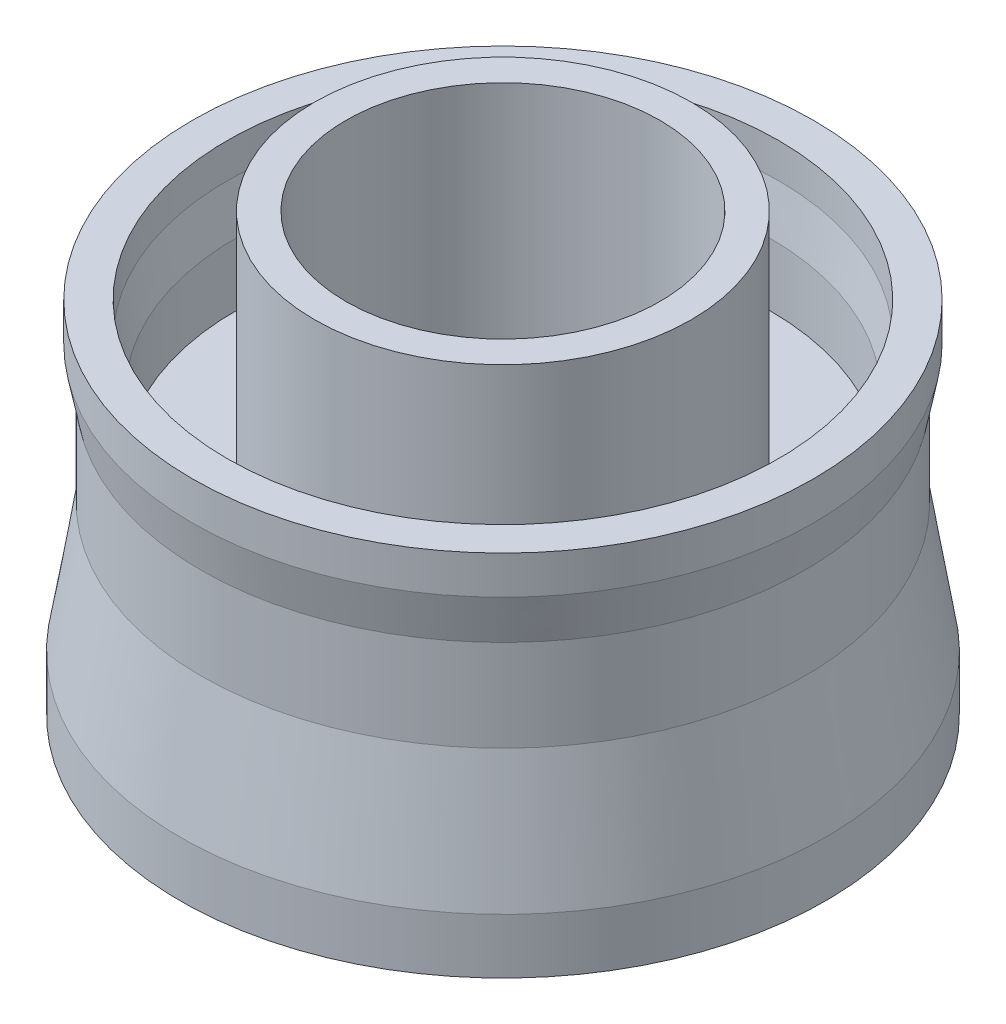
ISO-10303-21;
HEADER;
FILE_DESCRIPTION(('STEP AP214'),'2;1');
FILE_NAME('part.step','',(''),(''),'','','');
FILE_SCHEMA(('AUTOMOTIVE_DESIGN { 1 0 10303 214 1 1 1 1 }'));
ENDSEC;
DATA;
#1=APPLICATION_CONTEXT('core data for automotive mechanical design processes');
#2=APPLICATION_PROTOCOL_DEFINITION('international standard','automotive_design',2000,#1);
#3=PRODUCT_CONTEXT('',#1,'mechanical');
#4=PRODUCT('Part','Part','',(#3));
#5=PRODUCT_RELATED_PRODUCT_CATEGORY('part','',(#4));
#6=PRODUCT_DEFINITION_FORMATION('','',#4);
#7=PRODUCT_DEFINITION_CONTEXT('part definition',#1,'design');
#8=PRODUCT_DEFINITION('design','',#6,#7);
#9=PRODUCT_DEFINITION_SHAPE('','',#8);
#10=(LENGTH_UNIT() NAMED_UNIT(*) SI_UNIT(.MILLI.,.METRE.));
#11=(NAMED_UNIT(*) PLANE_ANGLE_UNIT() SI_UNIT($,.RADIAN.));
#12=(NAMED_UNIT(*) SI_UNIT($,.STERADIAN.) SOLID_ANGLE_UNIT());
#13=UNCERTAINTY_MEASURE_WITH_UNIT(LENGTH_MEASURE(1.E-05),#10,'distance_accuracy_value','');
#14=(GEOMETRIC_REPRESENTATION_CONTEXT(3) GLOBAL_UNCERTAINTY_ASSIGNED_CONTEXT((#13)) GLOBAL_UNIT_ASSIGNED_CONTEXT((#10,
#11,#12)) REPRESENTATION_CONTEXT('',''));
#15=CARTESIAN_POINT('',(0.,0.,0.));
#16=DIRECTION('',(0.,0.,1.));
#17=DIRECTION('',(1.,0.,0.));
#18=AXIS2_PLACEMENT_3D('',#15,#16,#17);
#19=CARTESIAN_POINT('',(0.,0.,0.));
#20=DIRECTION('',(0.,-1.,0.));
#21=DIRECTION('',(0.,0.,-1.));
#22=AXIS2_PLACEMENT_3D('',#19,#20,#21);
#23=CYLINDRICAL_SURFACE('',#22,5.4);
#24=CARTESIAN_POINT('',(0.,12.5,0.));
#25=DIRECTION('',(0.,-1.,0.));
#26=DIRECTION('',(0.,0.,-1.));
#27=AXIS2_PLACEMENT_3D('',#24,#25,#26);
#28=CIRCLE('',#27,5.4);
#29=CARTESIAN_POINT('',(0.,12.5,-5.4));
#30=VERTEX_POINT('',#29);
#31=EDGE_CURVE('E41',#30,#30,#28,.T.);
#32=ORIENTED_EDGE('',*,*,#31,.T.);
#33=EDGE_LOOP('',(#32));
#34=FACE_BOUND('',#33,.T.);
#35=CARTESIAN_POINT('',(0.,6.2,0.));
#36=DIRECTION('',(0.,-1.,0.));
#37=DIRECTION('',(0.,0.,-1.));
#38=AXIS2_PLACEMENT_3D('',#35,#36,#37);
#39=CIRCLE('',#38,5.4);
#40=CARTESIAN_POINT('',(0.,6.2,-5.4));
#41=VERTEX_POINT('',#40);
#42=EDGE_CURVE('E66',#41,#41,#39,.T.);
#43=ORIENTED_EDGE('',*,*,#42,.F.);
#44=EDGE_LOOP('',(#43));
#45=FACE_BOUND('',#44,.T.);
#46=ADVANCED_FACE('F35',(#34,#45),#23,.T.);
#47=CARTESIAN_POINT('',(0.,12.5,-4.5));
#48=DIRECTION('',(0.,1.,0.));
#49=DIRECTION('',(0.,0.,1.));
#50=AXIS2_PLACEMENT_3D('',#47,#48,#49);
#51=PLANE('',#50);
#52=CARTESIAN_POINT('',(0.,12.5,0.));
#53=DIRECTION('',(0.,-1.,0.));
#54=DIRECTION('',(0.,0.,-1.));
#55=AXIS2_PLACEMENT_3D('',#52,#53,#54);
#56=CIRCLE('',#55,4.5);
#57=CARTESIAN_POINT('',(0.,12.5,-4.5));
#58=VERTEX_POINT('',#57);
#59=EDGE_CURVE('E45',#58,#58,#56,.T.);
#60=ORIENTED_EDGE('',*,*,#59,.T.);
#61=EDGE_LOOP('',(#60));
#62=FACE_BOUND('',#61,.T.);
#63=ORIENTED_EDGE('',*,*,#31,.F.);
#64=EDGE_LOOP('',(#63));
#65=FACE_BOUND('',#64,.T.);
#66=ADVANCED_FACE('F142',(#62,#65),#51,.T.);
#67=CARTESIAN_POINT('',(0.,0.,0.));
#68=DIRECTION('',(0.,-1.,0.));
#69=DIRECTION('',(0.,0.,-1.));
#70=AXIS2_PLACEMENT_3D('',#67,#68,#69);
#71=CYLINDRICAL_SURFACE('',#70,4.5);
#72=CARTESIAN_POINT('',(0.,4.3,0.));
#73=DIRECTION('',(0.,-1.,0.));
#74=DIRECTION('',(0.,0.,-1.));
#75=AXIS2_PLACEMENT_3D('',#72,#73,#74);
#76=CIRCLE('',#75,4.5);
#77=CARTESIAN_POINT('',(0.,4.3,-4.5));
#78=VERTEX_POINT('',#77);
#79=EDGE_CURVE('E49',#78,#78,#76,.T.);
#80=ORIENTED_EDGE('',*,*,#79,.T.);
#81=EDGE_LOOP('',(#80));
#82=FACE_BOUND('',#81,.T.);
#83=ORIENTED_EDGE('',*,*,#59,.F.);
#84=EDGE_LOOP('',(#83));
#85=FACE_BOUND('',#84,.T.);
#86=ADVANCED_FACE('F146',(#82,#85),#71,.F.);
#87=CARTESIAN_POINT('',(0.,4.3,-4.65));
#88=DIRECTION('',(0.,-1.,0.));
#89=DIRECTION('',(0.,0.,-1.));
#90=AXIS2_PLACEMENT_3D('',#87,#88,#89);
#91=PLANE('',#90);
#92=CARTESIAN_POINT('',(0.,4.3,0.));
#93=DIRECTION('',(0.,-1.,0.));
#94=DIRECTION('',(0.,0.,-1.));
#95=AXIS2_PLACEMENT_3D('',#92,#93,#94);
#96=CIRCLE('',#95,4.65);
#97=CARTESIAN_POINT('',(0.,4.3,-4.65));
#98=VERTEX_POINT('',#97);
#99=EDGE_CURVE('E54',#98,#98,#96,.T.);
#100=ORIENTED_EDGE('',*,*,#99,.T.);
#101=EDGE_LOOP('',(#100));
#102=FACE_BOUND('',#101,.T.);
#103=ORIENTED_EDGE('',*,*,#79,.F.);
#104=EDGE_LOOP('',(#103));
#105=FACE_BOUND('',#104,.T.);
#106=ADVANCED_FACE('F179',(#102,#105),#91,.T.);
#107=CARTESIAN_POINT('',(0.,0.,0.));
#108=DIRECTION('',(0.,-1.,0.));
#109=DIRECTION('',(0.,0.,-1.));
#110=AXIS2_PLACEMENT_3D('',#107,#108,#109);
#111=CYLINDRICAL_SURFACE('',#110,4.65);
#112=CARTESIAN_POINT('',(0.,1.,0.));
#113=DIRECTION('',(0.,-1.,0.));
#114=DIRECTION('',(0.,0.,-1.));
#115=AXIS2_PLACEMENT_3D('',#112,#113,#114);
#116=CIRCLE('',#115,4.65);
#117=CARTESIAN_POINT('',(0.,1.,-4.65));
#118=VERTEX_POINT('',#117);
#119=EDGE_CURVE('E57',#118,#118,#116,.T.);
#120=ORIENTED_EDGE('',*,*,#119,.T.);
#121=EDGE_LOOP('',(#120));
#122=FACE_BOUND('',#121,.T.);
#123=ORIENTED_EDGE('',*,*,#99,.F.);
#124=EDGE_LOOP('',(#123));
#125=FACE_BOUND('',#124,.T.);
#126=ADVANCED_FACE('F175',(#122,#125),#111,.F.);
#127=CARTESIAN_POINT('',(0.,1.,0.));
#128=DIRECTION('',(0.,-1.,0.));
#129=DIRECTION('',(0.,0.,-1.));
#130=AXIS2_PLACEMENT_3D('',#127,#128,#129);
#131=CONICAL_SURFACE('',#130,4.65,0.148889947609497);
#132=CARTESIAN_POINT('',(0.,0.,0.));
#133=DIRECTION('',(0.,-1.,0.));
#134=DIRECTION('',(0.,0.,-1.));
#135=AXIS2_PLACEMENT_3D('',#132,#133,#134);
#136=CIRCLE('',#135,4.8);
#137=CARTESIAN_POINT('',(0.,0.,-4.8));
#138=VERTEX_POINT('',#137);
#139=EDGE_CURVE('E60',#138,#138,#136,.T.);
#140=ORIENTED_EDGE('',*,*,#139,.T.);
#141=EDGE_LOOP('',(#140));
#142=FACE_BOUND('',#141,.T.);
#143=ORIENTED_EDGE('',*,*,#119,.F.);
#144=EDGE_LOOP('',(#143));
#145=FACE_BOUND('',#144,.T.);
#146=ADVANCED_FACE('F171',(#142,#145),#131,.F.);
#147=CARTESIAN_POINT('',(0.,0.,-5.6));
#148=DIRECTION('',(0.,-1.,0.));
#149=DIRECTION('',(0.,0.,-1.));
#150=AXIS2_PLACEMENT_3D('',#147,#148,#149);
#151=PLANE('',#150);
#152=CARTESIAN_POINT('',(0.,0.,0.));
#153=DIRECTION('',(0.,-1.,0.));
#154=DIRECTION('',(0.,0.,-1.));
#155=AXIS2_PLACEMENT_3D('',#152,#153,#154);
#156=CIRCLE('',#155,5.6);
#157=CARTESIAN_POINT('',(0.,0.,-5.6));
#158=VERTEX_POINT('',#157);
#159=EDGE_CURVE('E63',#158,#158,#156,.T.);
#160=ORIENTED_EDGE('',*,*,#159,.T.);
#161=EDGE_LOOP('',(#160));
#162=FACE_BOUND('',#161,.T.);
#163=ORIENTED_EDGE('',*,*,#139,.F.);
#164=EDGE_LOOP('',(#163));
#165=FACE_BOUND('',#164,.T.);
#166=ADVANCED_FACE('F164',(#162,#165),#151,.T.);
#167=CARTESIAN_POINT('',(0.,0.,0.));
#168=DIRECTION('',(0.,-1.,0.));
#169=DIRECTION('',(0.,0.,-1.));
#170=AXIS2_PLACEMENT_3D('',#167,#168,#169);
#171=CYLINDRICAL_SURFACE('',#170,5.6);
#172=CARTESIAN_POINT('',(0.,5.2,0.));
#173=DIRECTION('',(0.,-1.,0.));
#174=DIRECTION('',(0.,0.,-1.));
#175=AXIS2_PLACEMENT_3D('',#172,#173,#174);
#176=CIRCLE('',#175,5.6);
#177=CARTESIAN_POINT('',(0.,5.2,-5.6));
#178=VERTEX_POINT('',#177);
#179=EDGE_CURVE('E10',#178,#178,#176,.F.);
#180=ORIENTED_EDGE('',*,*,#179,.F.);
#181=EDGE_LOOP('',(#180));
#182=FACE_BOUND('',#181,.T.);
#183=ORIENTED_EDGE('',*,*,#159,.F.);
#184=EDGE_LOOP('',(#183));
#185=FACE_BOUND('',#184,.T.);
#186=ADVANCED_FACE('F155',(#182,#185),#171,.T.);
#187=CARTESIAN_POINT('',(0.,6.2,-5.4));
#188=DIRECTION('',(0.,1.,0.));
#189=DIRECTION('',(0.,0.,1.));
#190=AXIS2_PLACEMENT_3D('',#187,#188,#189);
#191=PLANE('',#190);
#192=ORIENTED_EDGE('',*,*,#42,.T.);
#193=EDGE_LOOP('',(#192));
#194=FACE_BOUND('',#193,.T.);
#195=CARTESIAN_POINT('',(0.,6.2,0.));
#196=DIRECTION('',(0.,-1.,0.));
#197=DIRECTION('',(0.,0.,-1.));
#198=AXIS2_PLACEMENT_3D('',#195,#196,#197);
#199=CIRCLE('',#198,7.65);
#200=CARTESIAN_POINT('',(0.,6.2,-7.65));
#201=VERTEX_POINT('',#200);
#202=EDGE_CURVE('E69',#201,#201,#199,.T.);
#203=ORIENTED_EDGE('',*,*,#202,.F.);
#204=EDGE_LOOP('',(#203));
#205=FACE_BOUND('',#204,.T.);
#206=ADVANCED_FACE('F151',(#194,#205),#191,.T.);
#207=CARTESIAN_POINT('',(0.,5.2,-7.65));
#208=DIRECTION('',(0.,-1.,0.));
#209=DIRECTION('',(0.,0.,-1.));
#210=AXIS2_PLACEMENT_3D('',#207,#208,#209);
#211=PLANE('',#210);
#212=CARTESIAN_POINT('',(0.,5.2,0.));
#213=DIRECTION('',(0.,-1.,0.));
#214=DIRECTION('',(0.,0.,-1.));
#215=AXIS2_PLACEMENT_3D('',#212,#213,#214);
#216=CIRCLE('',#215,7.65);
#217=CARTESIAN_POINT('',(0.,5.2,-7.65));
#218=VERTEX_POINT('',#217);
#219=EDGE_CURVE('E93',#218,#218,#216,.T.);
#220=ORIENTED_EDGE('',*,*,#219,.T.);
#221=EDGE_LOOP('',(#220));
#222=FACE_BOUND('',#221,.T.);
#223=ORIENTED_EDGE('',*,*,#179,.T.);
#224=EDGE_LOOP('',(#223));
#225=FACE_BOUND('',#224,.T.);
#226=ADVANCED_FACE('F154',(#222,#225),#211,.T.);
#227=CARTESIAN_POINT('',(0.,0.,0.));
#228=DIRECTION('',(0.,-1.,0.));
#229=DIRECTION('',(0.,0.,-1.));
#230=AXIS2_PLACEMENT_3D('',#227,#228,#229);
#231=CYLINDRICAL_SURFACE('',#230,8.9);
#232=CARTESIAN_POINT('',(0.,10.3,0.));
#233=DIRECTION('',(0.,-1.,0.));
#234=DIRECTION('',(0.,0.,-1.));
#235=AXIS2_PLACEMENT_3D('',#232,#233,#234);
#236=CIRCLE('',#235,8.9);
#237=CARTESIAN_POINT('',(0.,10.3,-8.9));
#238=VERTEX_POINT('',#237);
#239=EDGE_CURVE('E105',#238,#238,#236,.T.);
#240=ORIENTED_EDGE('',*,*,#239,.T.);
#241=EDGE_LOOP('',(#240));
#242=FACE_BOUND('',#241,.T.);
#243=CARTESIAN_POINT('',(0.,9.20471908205051,0.));
#244=DIRECTION('',(0.,-1.,0.));
#245=DIRECTION('',(0.,0.,-1.));
#246=AXIS2_PLACEMENT_3D('',#243,#244,#245);
#247=CIRCLE('',#246,8.9);
#248=CARTESIAN_POINT('',(0.,9.20471908205051,-8.9));
#249=VERTEX_POINT('',#248);
#250=EDGE_CURVE('E72',#249,#249,#247,.T.);
#251=ORIENTED_EDGE('',*,*,#250,.F.);
#252=EDGE_LOOP('',(#251));
#253=FACE_BOUND('',#252,.T.);
#254=ADVANCED_FACE('F109',(#242,#253),#231,.T.);
#255=CARTESIAN_POINT('',(0.,7.90471908205051,0.));
#256=DIRECTION('',(0.,1.,0.));
#257=DIRECTION('',(0.,0.,1.));
#258=AXIS2_PLACEMENT_3D('',#255,#256,#257);
#259=CONICAL_SURFACE('',#258,8.65,0.189988287918716);
#260=ORIENTED_EDGE('',*,*,#250,.T.);
#261=EDGE_LOOP('',(#260));
#262=FACE_BOUND('',#261,.T.);
#263=CARTESIAN_POINT('',(0.,7.90471908205051,0.));
#264=DIRECTION('',(0.,-1.,0.));
#265=DIRECTION('',(0.,0.,-1.));
#266=AXIS2_PLACEMENT_3D('',#263,#264,#265);
#267=CIRCLE('',#266,8.65);
#268=CARTESIAN_POINT('',(0.,7.90471908205051,-8.65));
#269=VERTEX_POINT('',#268);
#270=EDGE_CURVE('E75',#269,#269,#267,.T.);
#271=ORIENTED_EDGE('',*,*,#270,.F.);
#272=EDGE_LOOP('',(#271));
#273=FACE_BOUND('',#272,.T.);
#274=ADVANCED_FACE('F237',(#262,#273),#259,.T.);
#275=CARTESIAN_POINT('',(0.,0.,0.));
#276=DIRECTION('',(0.,-1.,0.));
#277=DIRECTION('',(0.,0.,-1.));
#278=AXIS2_PLACEMENT_3D('',#275,#276,#277);
#279=CYLINDRICAL_SURFACE('',#278,8.65);
#280=ORIENTED_EDGE('',*,*,#270,.T.);
#281=EDGE_LOOP('',(#280));
#282=FACE_BOUND('',#281,.T.);
#283=CARTESIAN_POINT('',(0.,5.2805549379971,0.));
#284=DIRECTION('',(0.,-1.,0.));
#285=DIRECTION('',(0.,0.,-1.));
#286=AXIS2_PLACEMENT_3D('',#283,#284,#285);
#287=CIRCLE('',#286,8.65);
#288=CARTESIAN_POINT('',(0.,5.2805549379971,-8.65));
#289=VERTEX_POINT('',#288);
#290=EDGE_CURVE('E78',#289,#289,#287,.T.);
#291=ORIENTED_EDGE('',*,*,#290,.F.);
#292=EDGE_LOOP('',(#291));
#293=FACE_BOUND('',#292,.T.);
#294=ADVANCED_FACE('F246',(#282,#293),#279,.T.);
#295=CARTESIAN_POINT('',(0.,1.58055493799711,0.));
#296=DIRECTION('',(0.,-1.,0.));
#297=DIRECTION('',(0.,0.,-1.));
#298=AXIS2_PLACEMENT_3D('',#295,#296,#297);
#299=CONICAL_SURFACE('',#298,9.25,0.160762740625835);
#300=ORIENTED_EDGE('',*,*,#290,.T.);
#301=EDGE_LOOP('',(#300));
#302=FACE_BOUND('',#301,.T.);
#303=CARTESIAN_POINT('',(0.,1.58055493799711,0.));
#304=DIRECTION('',(0.,-1.,0.));
#305=DIRECTION('',(0.,0.,-1.));
#306=AXIS2_PLACEMENT_3D('',#303,#304,#305);
#307=CIRCLE('',#306,9.25);
#308=CARTESIAN_POINT('',(0.,1.58055493799711,-9.25));
#309=VERTEX_POINT('',#308);
#310=EDGE_CURVE('E81',#309,#309,#307,.T.);
#311=ORIENTED_EDGE('',*,*,#310,.F.);
#312=EDGE_LOOP('',(#311));
#313=FACE_BOUND('',#312,.T.);
#314=ADVANCED_FACE('F257',(#302,#313),#299,.T.);
#315=CARTESIAN_POINT('',(0.,0.,0.));
#316=DIRECTION('',(0.,-1.,0.));
#317=DIRECTION('',(0.,0.,-1.));
#318=AXIS2_PLACEMENT_3D('',#315,#316,#317);
#319=CYLINDRICAL_SURFACE('',#318,9.25);
#320=ORIENTED_EDGE('',*,*,#310,.T.);
#321=EDGE_LOOP('',(#320));
#322=FACE_BOUND('',#321,.T.);
#323=CARTESIAN_POINT('',(0.,0.,0.));
#324=DIRECTION('',(0.,-1.,0.));
#325=DIRECTION('',(0.,0.,-1.));
#326=AXIS2_PLACEMENT_3D('',#323,#324,#325);
#327=CIRCLE('',#326,9.25);
#328=CARTESIAN_POINT('',(0.,0.,-9.25));
#329=VERTEX_POINT('',#328);
#330=EDGE_CURVE('E84',#329,#329,#327,.T.);
#331=ORIENTED_EDGE('',*,*,#330,.F.);
#332=EDGE_LOOP('',(#331));
#333=FACE_BOUND('',#332,.T.);
#334=ADVANCED_FACE('F268',(#322,#333),#319,.T.);
#335=CARTESIAN_POINT('',(0.,0.,-9.25));
#336=DIRECTION('',(0.,1.,0.));
#337=DIRECTION('',(0.,0.,1.));
#338=AXIS2_PLACEMENT_3D('',#335,#336,#337);
#339=PLANE('',#338);
#340=CARTESIAN_POINT('',(0.,0.,0.));
#341=DIRECTION('',(0.,-1.,0.));
#342=DIRECTION('',(0.,0.,-1.));
#343=AXIS2_PLACEMENT_3D('',#340,#341,#342);
#344=CIRCLE('',#343,8.25);
#345=CARTESIAN_POINT('',(0.,0.,-8.25));
#346=VERTEX_POINT('',#345);
#347=EDGE_CURVE('E87',#346,#346,#344,.T.);
#348=ORIENTED_EDGE('',*,*,#347,.F.);
#349=EDGE_LOOP('',(#348));
#350=FACE_BOUND('',#349,.T.);
#351=ORIENTED_EDGE('',*,*,#330,.T.);
#352=EDGE_LOOP('',(#351));
#353=FACE_BOUND('',#352,.T.);
#354=ADVANCED_FACE('F279',(#350,#353),#339,.F.);
#355=CARTESIAN_POINT('',(0.,0.,0.));
#356=DIRECTION('',(0.,-1.,0.));
#357=DIRECTION('',(0.,0.,-1.));
#358=AXIS2_PLACEMENT_3D('',#355,#356,#357);
#359=CYLINDRICAL_SURFACE('',#358,8.25);
#360=CARTESIAN_POINT('',(0.,1.5,0.));
#361=DIRECTION('',(0.,-1.,0.));
#362=DIRECTION('',(0.,0.,-1.));
#363=AXIS2_PLACEMENT_3D('',#360,#361,#362);
#364=CIRCLE('',#363,8.25);
#365=CARTESIAN_POINT('',(0.,1.5,-8.25));
#366=VERTEX_POINT('',#365);
#367=EDGE_CURVE('E90',#366,#366,#364,.T.);
#368=ORIENTED_EDGE('',*,*,#367,.F.);
#369=EDGE_LOOP('',(#368));
#370=FACE_BOUND('',#369,.T.);
#371=ORIENTED_EDGE('',*,*,#347,.T.);
#372=EDGE_LOOP('',(#371));
#373=FACE_BOUND('',#372,.T.);
#374=ADVANCED_FACE('F138',(#370,#373),#359,.F.);
#375=CARTESIAN_POINT('',(0.,1.5,0.));
#376=DIRECTION('',(0.,-1.,0.));
#377=DIRECTION('',(0.,0.,-1.));
#378=AXIS2_PLACEMENT_3D('',#375,#376,#377);
#379=CONICAL_SURFACE('',#378,8.25,0.160762740625835);
#380=ORIENTED_EDGE('',*,*,#219,.F.);
#381=EDGE_LOOP('',(#380));
#382=FACE_BOUND('',#381,.T.);
#383=ORIENTED_EDGE('',*,*,#367,.T.);
#384=EDGE_LOOP('',(#383));
#385=FACE_BOUND('',#384,.T.);
#386=ADVANCED_FACE('F132',(#382,#385),#379,.F.);
#387=CARTESIAN_POINT('',(0.,0.,0.));
#388=DIRECTION('',(0.,-1.,0.));
#389=DIRECTION('',(0.,0.,-1.));
#390=AXIS2_PLACEMENT_3D('',#387,#388,#389);
#391=CYLINDRICAL_SURFACE('',#390,7.65);
#392=ORIENTED_EDGE('',*,*,#202,.T.);
#393=EDGE_LOOP('',(#392));
#394=FACE_BOUND('',#393,.T.);
#395=CARTESIAN_POINT('',(0.,8.,0.));
#396=DIRECTION('',(0.,-1.,0.));
#397=DIRECTION('',(0.,0.,-1.));
#398=AXIS2_PLACEMENT_3D('',#395,#396,#397);
#399=CIRCLE('',#398,7.65);
#400=CARTESIAN_POINT('',(0.,8.,-7.65));
#401=VERTEX_POINT('',#400);
#402=EDGE_CURVE('E96',#401,#401,#399,.T.);
#403=ORIENTED_EDGE('',*,*,#402,.F.);
#404=EDGE_LOOP('',(#403));
#405=FACE_BOUND('',#404,.T.);
#406=ADVANCED_FACE('F127',(#394,#405),#391,.F.);
#407=CARTESIAN_POINT('',(0.,8.,0.));
#408=DIRECTION('',(0.,1.,0.));
#409=DIRECTION('',(0.,0.,1.));
#410=AXIS2_PLACEMENT_3D('',#407,#408,#409);
#411=CONICAL_SURFACE('',#410,7.65,0.189988287918715);
#412=CARTESIAN_POINT('',(0.,9.3,0.));
#413=DIRECTION('',(0.,-1.,0.));
#414=DIRECTION('',(0.,0.,-1.));
#415=AXIS2_PLACEMENT_3D('',#412,#413,#414);
#416=CIRCLE('',#415,7.9);
#417=CARTESIAN_POINT('',(0.,9.3,-7.9));
#418=VERTEX_POINT('',#417);
#419=EDGE_CURVE('E99',#418,#418,#416,.T.);
#420=ORIENTED_EDGE('',*,*,#419,.F.);
#421=EDGE_LOOP('',(#420));
#422=FACE_BOUND('',#421,.T.);
#423=ORIENTED_EDGE('',*,*,#402,.T.);
#424=EDGE_LOOP('',(#423));
#425=FACE_BOUND('',#424,.T.);
#426=ADVANCED_FACE('F121',(#422,#425),#411,.F.);
#427=CARTESIAN_POINT('',(0.,0.,0.));
#428=DIRECTION('',(0.,-1.,0.));
#429=DIRECTION('',(0.,0.,-1.));
#430=AXIS2_PLACEMENT_3D('',#427,#428,#429);
#431=CYLINDRICAL_SURFACE('',#430,7.9);
#432=CARTESIAN_POINT('',(0.,10.3,0.));
#433=DIRECTION('',(0.,-1.,0.));
#434=DIRECTION('',(0.,0.,-1.));
#435=AXIS2_PLACEMENT_3D('',#432,#433,#434);
#436=CIRCLE('',#435,7.9);
#437=CARTESIAN_POINT('',(0.,10.3,-7.9));
#438=VERTEX_POINT('',#437);
#439=EDGE_CURVE('E102',#438,#438,#436,.T.);
#440=ORIENTED_EDGE('',*,*,#439,.F.);
#441=EDGE_LOOP('',(#440));
#442=FACE_BOUND('',#441,.T.);
#443=ORIENTED_EDGE('',*,*,#419,.T.);
#444=EDGE_LOOP('',(#443));
#445=FACE_BOUND('',#444,.T.);
#446=ADVANCED_FACE('F115',(#442,#445),#431,.F.);
#447=CARTESIAN_POINT('',(0.,10.3,-7.9));
#448=DIRECTION('',(0.,-1.,0.));
#449=DIRECTION('',(0.,0.,-1.));
#450=AXIS2_PLACEMENT_3D('',#447,#448,#449);
#451=PLANE('',#450);
#452=ORIENTED_EDGE('',*,*,#239,.F.);
#453=EDGE_LOOP('',(#452));
#454=FACE_BOUND('',#453,.T.);
#455=ORIENTED_EDGE('',*,*,#439,.T.);
#456=EDGE_LOOP('',(#455));
#457=FACE_BOUND('',#456,.T.);
#458=ADVANCED_FACE('F112',(#454,#457),#451,.F.);
#459=CLOSED_SHELL('',(#46,#66,#86,#106,#126,#146,#166,#186,#206,#226,#254,#274,#294,#314,#334,
#354,#374,#386,#406,#426,#446,#458));
#460=MANIFOLD_SOLID_BREP('B2',#459);
#461=ADVANCED_BREP_SHAPE_REPRESENTATION('',(#18,#460),#14);
#462=SHAPE_DEFINITION_REPRESENTATION(#9,#461);
ENDSEC;
END-ISO-10303-21;
